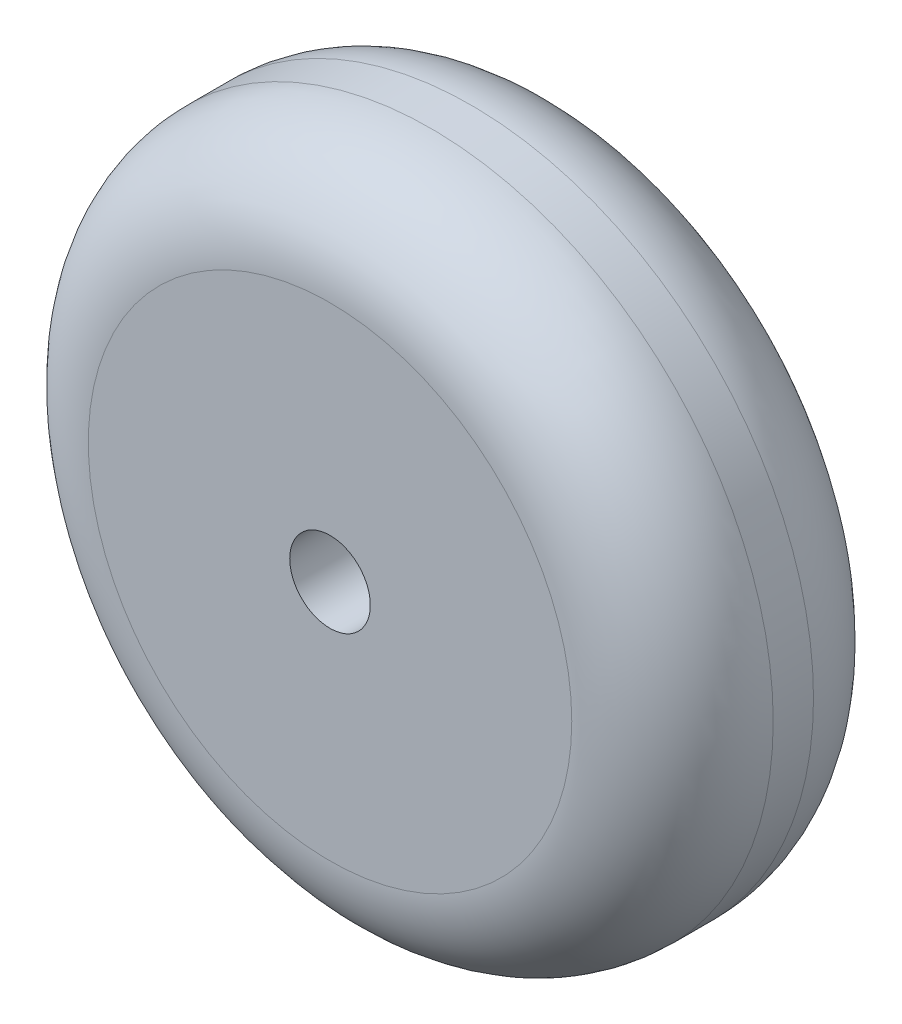
ISO-10303-21;
HEADER;
FILE_DESCRIPTION(('STEP AP214'),'2;1');
FILE_NAME('part.step','',(''),(''),'','','');
FILE_SCHEMA(('AUTOMOTIVE_DESIGN { 1 0 10303 214 1 1 1 1 }'));
ENDSEC;
DATA;
#1=APPLICATION_CONTEXT('core data for automotive mechanical design processes');
#2=APPLICATION_PROTOCOL_DEFINITION('international standard','automotive_design',2000,#1);
#3=PRODUCT_CONTEXT('',#1,'mechanical');
#4=PRODUCT('Part','Part','',(#3));
#5=PRODUCT_RELATED_PRODUCT_CATEGORY('part','',(#4));
#6=PRODUCT_DEFINITION_FORMATION('','',#4);
#7=PRODUCT_DEFINITION_CONTEXT('part definition',#1,'design');
#8=PRODUCT_DEFINITION('design','',#6,#7);
#9=PRODUCT_DEFINITION_SHAPE('','',#8);
#10=(LENGTH_UNIT() NAMED_UNIT(*) SI_UNIT(.MILLI.,.METRE.));
#11=(NAMED_UNIT(*) PLANE_ANGLE_UNIT() SI_UNIT($,.RADIAN.));
#12=(NAMED_UNIT(*) SI_UNIT($,.STERADIAN.) SOLID_ANGLE_UNIT());
#13=UNCERTAINTY_MEASURE_WITH_UNIT(LENGTH_MEASURE(1.E-05),#10,'distance_accuracy_value','');
#14=(GEOMETRIC_REPRESENTATION_CONTEXT(3) GLOBAL_UNCERTAINTY_ASSIGNED_CONTEXT((#13)) GLOBAL_UNIT_ASSIGNED_CONTEXT((#10,
#11,#12)) REPRESENTATION_CONTEXT('',''));
#15=CARTESIAN_POINT('',(0.,0.,0.));
#16=DIRECTION('',(0.,0.,1.));
#17=DIRECTION('',(1.,0.,0.));
#18=AXIS2_PLACEMENT_3D('',#15,#16,#17);
#19=CARTESIAN_POINT('',(0.,0.,60.));
#20=DIRECTION('',(0.,0.,-1.));
#21=DIRECTION('',(-1.,0.,0.));
#22=AXIS2_PLACEMENT_3D('',#19,#20,#21);
#23=CYLINDRICAL_SURFACE('',#22,85.);
#24=CARTESIAN_POINT('',(0.,0.,25.));
#25=DIRECTION('',(0.,0.,1.));
#26=DIRECTION('',(1.,0.,0.));
#27=AXIS2_PLACEMENT_3D('',#24,#25,#26);
#28=CIRCLE('',#27,85.);
#29=CARTESIAN_POINT('',(85.,0.,25.));
#30=VERTEX_POINT('',#29);
#31=EDGE_CURVE('E52',#30,#30,#28,.T.);
#32=ORIENTED_EDGE('',*,*,#31,.T.);
#33=EDGE_LOOP('',(#32));
#34=FACE_BOUND('',#33,.T.);
#35=CARTESIAN_POINT('',(0.,0.,35.));
#36=DIRECTION('',(0.,0.,1.));
#37=DIRECTION('',(1.,0.,0.));
#38=AXIS2_PLACEMENT_3D('',#35,#36,#37);
#39=CIRCLE('',#38,85.);
#40=CARTESIAN_POINT('',(85.,0.,35.));
#41=VERTEX_POINT('',#40);
#42=EDGE_CURVE('E56',#41,#41,#39,.F.);
#43=ORIENTED_EDGE('',*,*,#42,.T.);
#44=EDGE_LOOP('',(#43));
#45=FACE_BOUND('',#44,.T.);
#46=ADVANCED_FACE('F41',(#34,#45),#23,.T.);
#47=CARTESIAN_POINT('',(0.,0.,60.));
#48=DIRECTION('',(0.,0.,1.));
#49=DIRECTION('',(1.,0.,0.));
#50=AXIS2_PLACEMENT_3D('',#47,#48,#49);
#51=PLANE('',#50);
#52=CARTESIAN_POINT('',(0.,0.,60.));
#53=DIRECTION('',(0.,0.,-1.));
#54=DIRECTION('',(-1.,0.,0.));
#55=AXIS2_PLACEMENT_3D('',#52,#53,#54);
#56=CIRCLE('',#55,10.);
#57=CARTESIAN_POINT('',(-10.,0.,60.));
#58=VERTEX_POINT('',#57);
#59=EDGE_CURVE('E61',#58,#58,#56,.T.);
#60=ORIENTED_EDGE('',*,*,#59,.T.);
#61=EDGE_LOOP('',(#60));
#62=FACE_BOUND('',#61,.T.);
#63=CARTESIAN_POINT('',(0.,0.,60.));
#64=DIRECTION('',(0.,0.,1.));
#65=DIRECTION('',(1.,0.,0.));
#66=AXIS2_PLACEMENT_3D('',#63,#64,#65);
#67=CIRCLE('',#66,60.);
#68=CARTESIAN_POINT('',(60.,0.,60.));
#69=VERTEX_POINT('',#68);
#70=EDGE_CURVE('E10',#69,#69,#67,.T.);
#71=ORIENTED_EDGE('',*,*,#70,.T.);
#72=EDGE_LOOP('',(#71));
#73=FACE_BOUND('',#72,.T.);
#74=ADVANCED_FACE('F68',(#62,#73),#51,.T.);
#75=CARTESIAN_POINT('',(0.,0.,0.));
#76=DIRECTION('',(0.,0.,1.));
#77=DIRECTION('',(1.,0.,0.));
#78=AXIS2_PLACEMENT_3D('',#75,#76,#77);
#79=PLANE('',#78);
#80=CARTESIAN_POINT('',(0.,0.,0.));
#81=DIRECTION('',(0.,0.,-1.));
#82=DIRECTION('',(-1.,0.,0.));
#83=AXIS2_PLACEMENT_3D('',#80,#81,#82);
#84=CIRCLE('',#83,10.);
#85=CARTESIAN_POINT('',(-10.,0.,0.));
#86=VERTEX_POINT('',#85);
#87=EDGE_CURVE('E62',#86,#86,#84,.T.);
#88=ORIENTED_EDGE('',*,*,#87,.F.);
#89=EDGE_LOOP('',(#88));
#90=FACE_BOUND('',#89,.T.);
#91=CARTESIAN_POINT('',(0.,0.,0.));
#92=DIRECTION('',(0.,0.,1.));
#93=DIRECTION('',(1.,0.,0.));
#94=AXIS2_PLACEMENT_3D('',#91,#92,#93);
#95=CIRCLE('',#94,60.);
#96=CARTESIAN_POINT('',(60.,0.,0.));
#97=VERTEX_POINT('',#96);
#98=EDGE_CURVE('E48',#97,#97,#95,.F.);
#99=ORIENTED_EDGE('',*,*,#98,.T.);
#100=EDGE_LOOP('',(#99));
#101=FACE_BOUND('',#100,.T.);
#102=ADVANCED_FACE('F76',(#90,#101),#79,.F.);
#103=CARTESIAN_POINT('',(0.,0.,25.));
#104=DIRECTION('',(0.,0.,1.));
#105=DIRECTION('',(1.,0.,0.));
#106=AXIS2_PLACEMENT_3D('',#103,#104,#105);
#107=TOROIDAL_SURFACE('',#106,60.,25.);
#108=ORIENTED_EDGE('',*,*,#98,.F.);
#109=EDGE_LOOP('',(#108));
#110=FACE_BOUND('',#109,.T.);
#111=ORIENTED_EDGE('',*,*,#31,.F.);
#112=EDGE_LOOP('',(#111));
#113=FACE_BOUND('',#112,.T.);
#114=ADVANCED_FACE('F78',(#110,#113),#107,.T.);
#115=CARTESIAN_POINT('',(0.,0.,35.));
#116=DIRECTION('',(0.,0.,1.));
#117=DIRECTION('',(1.,0.,0.));
#118=AXIS2_PLACEMENT_3D('',#115,#116,#117);
#119=TOROIDAL_SURFACE('',#118,60.,25.);
#120=ORIENTED_EDGE('',*,*,#42,.F.);
#121=EDGE_LOOP('',(#120));
#122=FACE_BOUND('',#121,.T.);
#123=ORIENTED_EDGE('',*,*,#70,.F.);
#124=EDGE_LOOP('',(#123));
#125=FACE_BOUND('',#124,.T.);
#126=ADVANCED_FACE('F43',(#122,#125),#119,.T.);
#127=CARTESIAN_POINT('',(0.,0.,60.));
#128=DIRECTION('',(0.,0.,-1.));
#129=DIRECTION('',(-1.,0.,0.));
#130=AXIS2_PLACEMENT_3D('',#127,#128,#129);
#131=CYLINDRICAL_SURFACE('',#130,10.);
#132=ORIENTED_EDGE('',*,*,#59,.F.);
#133=EDGE_LOOP('',(#132));
#134=FACE_BOUND('',#133,.T.);
#135=ORIENTED_EDGE('',*,*,#87,.T.);
#136=EDGE_LOOP('',(#135));
#137=FACE_BOUND('',#136,.T.);
#138=ADVANCED_FACE('F70',(#134,#137),#131,.F.);
#139=CLOSED_SHELL('',(#46,#74,#102,#114,#126,#138));
#140=MANIFOLD_SOLID_BREP('B2',#139);
#141=ADVANCED_BREP_SHAPE_REPRESENTATION('',(#18,#140),#14);
#142=SHAPE_DEFINITION_REPRESENTATION(#9,#141);
ENDSEC;
END-ISO-10303-21;
